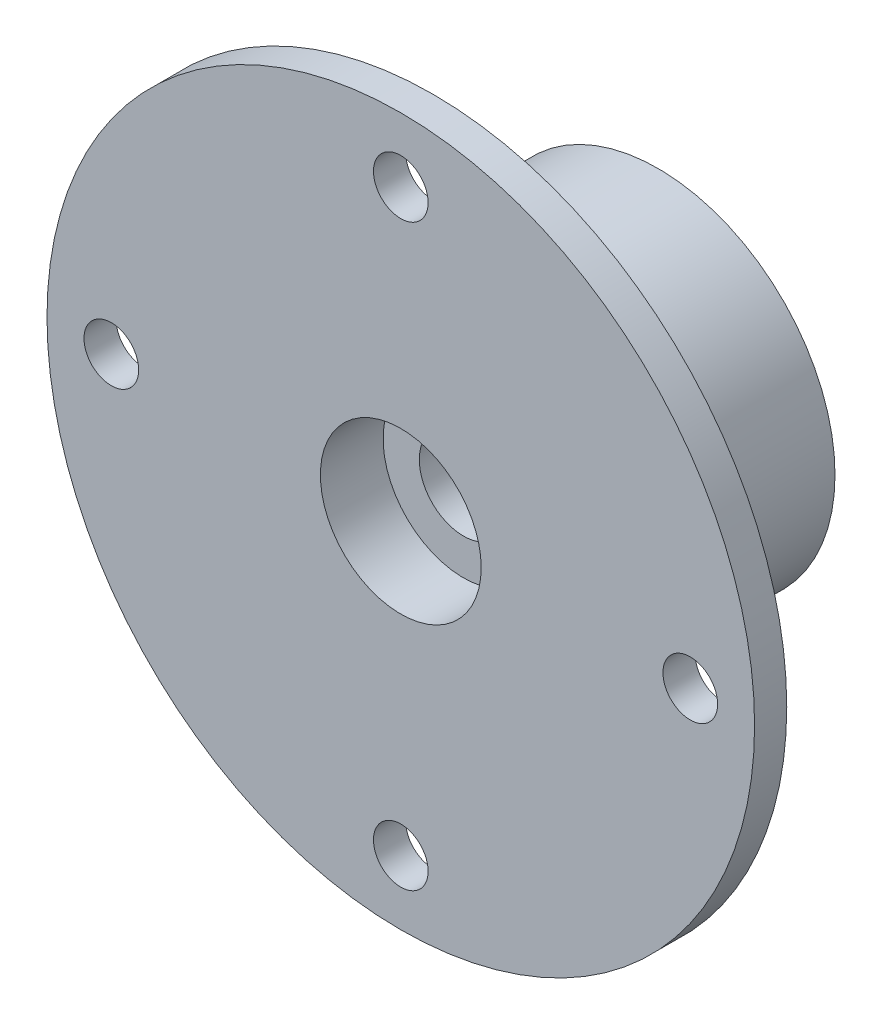
ISO-10303-21;
HEADER;
FILE_DESCRIPTION(('STEP AP214'),'2;1');
FILE_NAME('part.step','',(''),(''),'','','');
FILE_SCHEMA(('AUTOMOTIVE_DESIGN { 1 0 10303 214 1 1 1 1 }'));
ENDSEC;
DATA;
#1=APPLICATION_CONTEXT('core data for automotive mechanical design processes');
#2=APPLICATION_PROTOCOL_DEFINITION('international standard','automotive_design',2000,#1);
#3=PRODUCT_CONTEXT('',#1,'mechanical');
#4=PRODUCT('Part','Part','',(#3));
#5=PRODUCT_RELATED_PRODUCT_CATEGORY('part','',(#4));
#6=PRODUCT_DEFINITION_FORMATION('','',#4);
#7=PRODUCT_DEFINITION_CONTEXT('part definition',#1,'design');
#8=PRODUCT_DEFINITION('design','',#6,#7);
#9=PRODUCT_DEFINITION_SHAPE('','',#8);
#10=(LENGTH_UNIT() NAMED_UNIT(*) SI_UNIT(.MILLI.,.METRE.));
#11=(NAMED_UNIT(*) PLANE_ANGLE_UNIT() SI_UNIT($,.RADIAN.));
#12=(NAMED_UNIT(*) SI_UNIT($,.STERADIAN.) SOLID_ANGLE_UNIT());
#13=UNCERTAINTY_MEASURE_WITH_UNIT(LENGTH_MEASURE(1.E-05),#10,'distance_accuracy_value','');
#14=(GEOMETRIC_REPRESENTATION_CONTEXT(3) GLOBAL_UNCERTAINTY_ASSIGNED_CONTEXT((#13)) GLOBAL_UNIT_ASSIGNED_CONTEXT((#10,
#11,#12)) REPRESENTATION_CONTEXT('',''));
#15=CARTESIAN_POINT('',(0.,0.,0.));
#16=DIRECTION('',(0.,0.,1.));
#17=DIRECTION('',(1.,0.,0.));
#18=AXIS2_PLACEMENT_3D('',#15,#16,#17);
#19=CARTESIAN_POINT('',(0.,0.,14.));
#20=DIRECTION('',(0.,0.,-1.));
#21=DIRECTION('',(-1.,0.,0.));
#22=AXIS2_PLACEMENT_3D('',#19,#20,#21);
#23=CYLINDRICAL_SURFACE('',#22,11.);
#24=CARTESIAN_POINT('',(0.,0.,13.5));
#25=DIRECTION('',(0.,0.,1.));
#26=DIRECTION('',(1.,0.,0.));
#27=AXIS2_PLACEMENT_3D('',#24,#25,#26);
#28=CIRCLE('',#27,11.);
#29=CARTESIAN_POINT('',(11.,0.,13.5));
#30=VERTEX_POINT('',#29);
#31=EDGE_CURVE('E10',#30,#30,#28,.F.);
#32=ORIENTED_EDGE('',*,*,#31,.T.);
#33=EDGE_LOOP('',(#32));
#34=FACE_BOUND('',#33,.T.);
#35=CARTESIAN_POINT('',(0.,0.,0.));
#36=DIRECTION('',(0.,0.,1.));
#37=DIRECTION('',(1.,0.,0.));
#38=AXIS2_PLACEMENT_3D('',#35,#36,#37);
#39=CIRCLE('',#38,11.);
#40=CARTESIAN_POINT('',(11.,0.,0.));
#41=VERTEX_POINT('',#40);
#42=EDGE_CURVE('E56',#41,#41,#39,.T.);
#43=ORIENTED_EDGE('',*,*,#42,.T.);
#44=EDGE_LOOP('',(#43));
#45=FACE_BOUND('',#44,.T.);
#46=ADVANCED_FACE('F43',(#34,#45),#23,.T.);
#47=CARTESIAN_POINT('',(0.,0.,0.));
#48=DIRECTION('',(0.,0.,1.));
#49=DIRECTION('',(1.,0.,0.));
#50=AXIS2_PLACEMENT_3D('',#47,#48,#49);
#51=PLANE('',#50);
#52=CARTESIAN_POINT('',(0.,0.,0.));
#53=DIRECTION('',(0.,0.,1.));
#54=DIRECTION('',(1.,0.,0.));
#55=AXIS2_PLACEMENT_3D('',#52,#53,#54);
#56=CIRCLE('',#55,2.75);
#57=CARTESIAN_POINT('',(2.75,0.,0.));
#58=VERTEX_POINT('',#57);
#59=EDGE_CURVE('E103',#58,#58,#56,.T.);
#60=ORIENTED_EDGE('',*,*,#59,.T.);
#61=EDGE_LOOP('',(#60));
#62=FACE_BOUND('',#61,.T.);
#63=ORIENTED_EDGE('',*,*,#42,.F.);
#64=EDGE_LOOP('',(#63));
#65=FACE_BOUND('',#64,.T.);
#66=ADVANCED_FACE('F140',(#62,#65),#51,.F.);
#67=CARTESIAN_POINT('',(0.,0.,16.));
#68=DIRECTION('',(0.,0.,-1.));
#69=DIRECTION('',(-1.,0.,0.));
#70=AXIS2_PLACEMENT_3D('',#67,#68,#69);
#71=CYLINDRICAL_SURFACE('',#70,22.);
#72=CARTESIAN_POINT('',(0.,0.,16.));
#73=DIRECTION('',(0.,0.,1.));
#74=DIRECTION('',(1.,0.,0.));
#75=AXIS2_PLACEMENT_3D('',#72,#73,#74);
#76=CIRCLE('',#75,22.);
#77=CARTESIAN_POINT('',(22.,0.,16.));
#78=VERTEX_POINT('',#77);
#79=EDGE_CURVE('E61',#78,#78,#76,.T.);
#80=ORIENTED_EDGE('',*,*,#79,.F.);
#81=EDGE_LOOP('',(#80));
#82=FACE_BOUND('',#81,.T.);
#83=CARTESIAN_POINT('',(0.,0.,14.));
#84=DIRECTION('',(0.,0.,1.));
#85=DIRECTION('',(1.,0.,0.));
#86=AXIS2_PLACEMENT_3D('',#83,#84,#85);
#87=CIRCLE('',#86,22.);
#88=CARTESIAN_POINT('',(22.,0.,14.));
#89=VERTEX_POINT('',#88);
#90=EDGE_CURVE('E80',#89,#89,#87,.T.);
#91=ORIENTED_EDGE('',*,*,#90,.T.);
#92=EDGE_LOOP('',(#91));
#93=FACE_BOUND('',#92,.T.);
#94=ADVANCED_FACE('F126',(#82,#93),#71,.T.);
#95=CARTESIAN_POINT('',(0.,0.,16.));
#96=DIRECTION('',(0.,0.,1.));
#97=DIRECTION('',(1.,0.,0.));
#98=AXIS2_PLACEMENT_3D('',#95,#96,#97);
#99=PLANE('',#98);
#100=CARTESIAN_POINT('',(0.,0.,16.));
#101=DIRECTION('',(0.,0.,1.));
#102=DIRECTION('',(1.,0.,0.));
#103=AXIS2_PLACEMENT_3D('',#100,#101,#102);
#104=CIRCLE('',#103,5.);
#105=CARTESIAN_POINT('',(5.,0.,16.));
#106=VERTEX_POINT('',#105);
#107=EDGE_CURVE('E115',#106,#106,#104,.T.);
#108=ORIENTED_EDGE('',*,*,#107,.F.);
#109=EDGE_LOOP('',(#108));
#110=FACE_BOUND('',#109,.T.);
#111=CARTESIAN_POINT('',(0.,18.,16.));
#112=DIRECTION('',(0.,0.,1.));
#113=DIRECTION('',(1.,0.,0.));
#114=AXIS2_PLACEMENT_3D('',#111,#112,#113);
#115=CIRCLE('',#114,1.7);
#116=CARTESIAN_POINT('',(1.7,18.,16.));
#117=VERTEX_POINT('',#116);
#118=EDGE_CURVE('E69',#117,#117,#115,.T.);
#119=ORIENTED_EDGE('',*,*,#118,.F.);
#120=EDGE_LOOP('',(#119));
#121=FACE_BOUND('',#120,.T.);
#122=CARTESIAN_POINT('',(18.0000000000005,5.08284223389574E-13,16.));
#123=DIRECTION('',(0.,0.,1.));
#124=DIRECTION('',(1.,0.,0.));
#125=AXIS2_PLACEMENT_3D('',#122,#123,#124);
#126=CIRCLE('',#125,1.7);
#127=CARTESIAN_POINT('',(19.7000000000005,5.08284223389574E-13,16.));
#128=VERTEX_POINT('',#127);
#129=EDGE_CURVE('E68',#128,#128,#126,.T.);
#130=ORIENTED_EDGE('',*,*,#129,.F.);
#131=EDGE_LOOP('',(#130));
#132=FACE_BOUND('',#131,.T.);
#133=CARTESIAN_POINT('',(1.01656844677915E-12,-18.,16.));
#134=DIRECTION('',(0.,0.,1.));
#135=DIRECTION('',(1.,0.,0.));
#136=AXIS2_PLACEMENT_3D('',#133,#134,#135);
#137=CIRCLE('',#136,1.7);
#138=CARTESIAN_POINT('',(1.70000000000101,-18.,16.));
#139=VERTEX_POINT('',#138);
#140=EDGE_CURVE('E74',#139,#139,#137,.T.);
#141=ORIENTED_EDGE('',*,*,#140,.F.);
#142=EDGE_LOOP('',(#141));
#143=FACE_BOUND('',#142,.T.);
#144=CARTESIAN_POINT('',(-17.9999999999995,-5.06079859151109E-13,16.));
#145=DIRECTION('',(0.,0.,1.));
#146=DIRECTION('',(1.,0.,0.));
#147=AXIS2_PLACEMENT_3D('',#144,#145,#146);
#148=CIRCLE('',#147,1.7);
#149=CARTESIAN_POINT('',(-16.2999999999995,-5.06079859151109E-13,16.));
#150=VERTEX_POINT('',#149);
#151=EDGE_CURVE('E78',#150,#150,#148,.T.);
#152=ORIENTED_EDGE('',*,*,#151,.F.);
#153=EDGE_LOOP('',(#152));
#154=FACE_BOUND('',#153,.T.);
#155=ORIENTED_EDGE('',*,*,#79,.T.);
#156=EDGE_LOOP('',(#155));
#157=FACE_BOUND('',#156,.T.);
#158=ADVANCED_FACE('F122',(#110,#121,#132,#143,#154,#157),#99,.T.);
#159=CARTESIAN_POINT('',(0.,0.,14.));
#160=DIRECTION('',(0.,0.,1.));
#161=DIRECTION('',(1.,0.,0.));
#162=AXIS2_PLACEMENT_3D('',#159,#160,#161);
#163=PLANE('',#162);
#164=CARTESIAN_POINT('',(0.,0.,14.));
#165=DIRECTION('',(0.,0.,1.));
#166=DIRECTION('',(1.,0.,0.));
#167=AXIS2_PLACEMENT_3D('',#164,#165,#166);
#168=CIRCLE('',#167,11.5);
#169=CARTESIAN_POINT('',(11.5,0.,14.));
#170=VERTEX_POINT('',#169);
#171=EDGE_CURVE('E51',#170,#170,#168,.T.);
#172=ORIENTED_EDGE('',*,*,#171,.T.);
#173=EDGE_LOOP('',(#172));
#174=FACE_BOUND('',#173,.T.);
#175=CARTESIAN_POINT('',(0.,18.,14.));
#176=DIRECTION('',(0.,0.,1.));
#177=DIRECTION('',(1.,0.,0.));
#178=AXIS2_PLACEMENT_3D('',#175,#176,#177);
#179=CIRCLE('',#178,1.7);
#180=CARTESIAN_POINT('',(1.7,18.,14.));
#181=VERTEX_POINT('',#180);
#182=EDGE_CURVE('E64',#181,#181,#179,.T.);
#183=ORIENTED_EDGE('',*,*,#182,.T.);
#184=EDGE_LOOP('',(#183));
#185=FACE_BOUND('',#184,.T.);
#186=CARTESIAN_POINT('',(18.0000000000005,5.08284223389574E-13,14.));
#187=DIRECTION('',(0.,0.,1.));
#188=DIRECTION('',(1.,0.,0.));
#189=AXIS2_PLACEMENT_3D('',#186,#187,#188);
#190=CIRCLE('',#189,1.7);
#191=CARTESIAN_POINT('',(19.7000000000005,5.08284223389574E-13,14.));
#192=VERTEX_POINT('',#191);
#193=EDGE_CURVE('E70',#192,#192,#190,.T.);
#194=ORIENTED_EDGE('',*,*,#193,.T.);
#195=EDGE_LOOP('',(#194));
#196=FACE_BOUND('',#195,.T.);
#197=CARTESIAN_POINT('',(1.01656844677915E-12,-18.,14.));
#198=DIRECTION('',(0.,0.,1.));
#199=DIRECTION('',(1.,0.,0.));
#200=AXIS2_PLACEMENT_3D('',#197,#198,#199);
#201=CIRCLE('',#200,1.7);
#202=CARTESIAN_POINT('',(1.70000000000101,-18.,14.));
#203=VERTEX_POINT('',#202);
#204=EDGE_CURVE('E75',#203,#203,#201,.T.);
#205=ORIENTED_EDGE('',*,*,#204,.T.);
#206=EDGE_LOOP('',(#205));
#207=FACE_BOUND('',#206,.T.);
#208=CARTESIAN_POINT('',(-17.9999999999995,-5.06079859151109E-13,14.));
#209=DIRECTION('',(0.,0.,1.));
#210=DIRECTION('',(1.,0.,0.));
#211=AXIS2_PLACEMENT_3D('',#208,#209,#210);
#212=CIRCLE('',#211,1.7);
#213=CARTESIAN_POINT('',(-16.2999999999995,-5.06079859151109E-13,14.));
#214=VERTEX_POINT('',#213);
#215=EDGE_CURVE('E84',#214,#214,#212,.T.);
#216=ORIENTED_EDGE('',*,*,#215,.T.);
#217=EDGE_LOOP('',(#216));
#218=FACE_BOUND('',#217,.T.);
#219=ORIENTED_EDGE('',*,*,#90,.F.);
#220=EDGE_LOOP('',(#219));
#221=FACE_BOUND('',#220,.T.);
#222=ADVANCED_FACE('F125',(#174,#185,#196,#207,#218,#221),#163,.F.);
#223=CARTESIAN_POINT('',(-17.9999999999995,-5.06079859151109E-13,16.));
#224=DIRECTION('',(0.,0.,1.));
#225=DIRECTION('',(1.,0.,0.));
#226=AXIS2_PLACEMENT_3D('',#223,#224,#225);
#227=CYLINDRICAL_SURFACE('',#226,1.7);
#228=ORIENTED_EDGE('',*,*,#151,.T.);
#229=EDGE_LOOP('',(#228));
#230=FACE_BOUND('',#229,.T.);
#231=ORIENTED_EDGE('',*,*,#215,.F.);
#232=EDGE_LOOP('',(#231));
#233=FACE_BOUND('',#232,.T.);
#234=ADVANCED_FACE('F145',(#230,#233),#227,.F.);
#235=CARTESIAN_POINT('',(1.01656844677915E-12,-18.,16.));
#236=DIRECTION('',(0.,0.,1.));
#237=DIRECTION('',(1.,0.,0.));
#238=AXIS2_PLACEMENT_3D('',#235,#236,#237);
#239=CYLINDRICAL_SURFACE('',#238,1.7);
#240=ORIENTED_EDGE('',*,*,#140,.T.);
#241=EDGE_LOOP('',(#240));
#242=FACE_BOUND('',#241,.T.);
#243=ORIENTED_EDGE('',*,*,#204,.F.);
#244=EDGE_LOOP('',(#243));
#245=FACE_BOUND('',#244,.T.);
#246=ADVANCED_FACE('F152',(#242,#245),#239,.F.);
#247=CARTESIAN_POINT('',(18.0000000000005,5.08284223389574E-13,16.));
#248=DIRECTION('',(0.,0.,1.));
#249=DIRECTION('',(1.,0.,0.));
#250=AXIS2_PLACEMENT_3D('',#247,#248,#249);
#251=CYLINDRICAL_SURFACE('',#250,1.7);
#252=ORIENTED_EDGE('',*,*,#129,.T.);
#253=EDGE_LOOP('',(#252));
#254=FACE_BOUND('',#253,.T.);
#255=ORIENTED_EDGE('',*,*,#193,.F.);
#256=EDGE_LOOP('',(#255));
#257=FACE_BOUND('',#256,.T.);
#258=ADVANCED_FACE('F189',(#254,#257),#251,.F.);
#259=CARTESIAN_POINT('',(0.,18.,16.));
#260=DIRECTION('',(0.,0.,1.));
#261=DIRECTION('',(1.,0.,0.));
#262=AXIS2_PLACEMENT_3D('',#259,#260,#261);
#263=CYLINDRICAL_SURFACE('',#262,1.7);
#264=ORIENTED_EDGE('',*,*,#118,.T.);
#265=EDGE_LOOP('',(#264));
#266=FACE_BOUND('',#265,.T.);
#267=ORIENTED_EDGE('',*,*,#182,.F.);
#268=EDGE_LOOP('',(#267));
#269=FACE_BOUND('',#268,.T.);
#270=ADVANCED_FACE('F174',(#266,#269),#263,.F.);
#271=CARTESIAN_POINT('',(0.,0.,16.));
#272=DIRECTION('',(0.,0.,1.));
#273=DIRECTION('',(1.,0.,0.));
#274=AXIS2_PLACEMENT_3D('',#271,#272,#273);
#275=CYLINDRICAL_SURFACE('',#274,2.75);
#276=ORIENTED_EDGE('',*,*,#59,.F.);
#277=EDGE_LOOP('',(#276));
#278=FACE_BOUND('',#277,.T.);
#279=CARTESIAN_POINT('',(0.,0.,12.1));
#280=DIRECTION('',(0.,0.,1.));
#281=DIRECTION('',(1.,0.,0.));
#282=AXIS2_PLACEMENT_3D('',#279,#280,#281);
#283=CIRCLE('',#282,2.75);
#284=CARTESIAN_POINT('',(2.75,0.,12.1));
#285=VERTEX_POINT('',#284);
#286=EDGE_CURVE('E107',#285,#285,#283,.T.);
#287=ORIENTED_EDGE('',*,*,#286,.T.);
#288=EDGE_LOOP('',(#287));
#289=FACE_BOUND('',#288,.T.);
#290=ADVANCED_FACE('F170',(#278,#289),#275,.F.);
#291=CARTESIAN_POINT('',(2.75,0.,12.1));
#292=DIRECTION('',(0.,0.,-1.));
#293=DIRECTION('',(-1.,0.,0.));
#294=AXIS2_PLACEMENT_3D('',#291,#292,#293);
#295=PLANE('',#294);
#296=ORIENTED_EDGE('',*,*,#286,.F.);
#297=EDGE_LOOP('',(#296));
#298=FACE_BOUND('',#297,.T.);
#299=CARTESIAN_POINT('',(0.,0.,12.1));
#300=DIRECTION('',(0.,0.,1.));
#301=DIRECTION('',(1.,0.,0.));
#302=AXIS2_PLACEMENT_3D('',#299,#300,#301);
#303=CIRCLE('',#302,5.);
#304=CARTESIAN_POINT('',(5.,0.,12.1));
#305=VERTEX_POINT('',#304);
#306=EDGE_CURVE('E111',#305,#305,#303,.T.);
#307=ORIENTED_EDGE('',*,*,#306,.T.);
#308=EDGE_LOOP('',(#307));
#309=FACE_BOUND('',#308,.T.);
#310=ADVANCED_FACE('F173',(#298,#309),#295,.F.);
#311=CARTESIAN_POINT('',(0.,0.,16.));
#312=DIRECTION('',(0.,0.,1.));
#313=DIRECTION('',(1.,0.,0.));
#314=AXIS2_PLACEMENT_3D('',#311,#312,#313);
#315=CYLINDRICAL_SURFACE('',#314,5.);
#316=ORIENTED_EDGE('',*,*,#306,.F.);
#317=EDGE_LOOP('',(#316));
#318=FACE_BOUND('',#317,.T.);
#319=ORIENTED_EDGE('',*,*,#107,.T.);
#320=EDGE_LOOP('',(#319));
#321=FACE_BOUND('',#320,.T.);
#322=ADVANCED_FACE('F120',(#318,#321),#315,.F.);
#323=CARTESIAN_POINT('',(0.,0.,13.5));
#324=DIRECTION('',(0.,0.,1.));
#325=DIRECTION('',(1.,0.,0.));
#326=AXIS2_PLACEMENT_3D('',#323,#324,#325);
#327=TOROIDAL_SURFACE('',#326,11.5,0.5);
#328=ORIENTED_EDGE('',*,*,#31,.F.);
#329=EDGE_LOOP('',(#328));
#330=FACE_BOUND('',#329,.T.);
#331=ORIENTED_EDGE('',*,*,#171,.F.);
#332=EDGE_LOOP('',(#331));
#333=FACE_BOUND('',#332,.T.);
#334=ADVANCED_FACE('F45',(#330,#333),#327,.F.);
#335=CLOSED_SHELL('',(#46,#66,#94,#158,#222,#234,#246,#258,#270,#290,#310,#322,#334));
#336=MANIFOLD_SOLID_BREP('B2',#335);
#337=ADVANCED_BREP_SHAPE_REPRESENTATION('',(#18,#336),#14);
#338=SHAPE_DEFINITION_REPRESENTATION(#9,#337);
ENDSEC;
END-ISO-10303-21;
